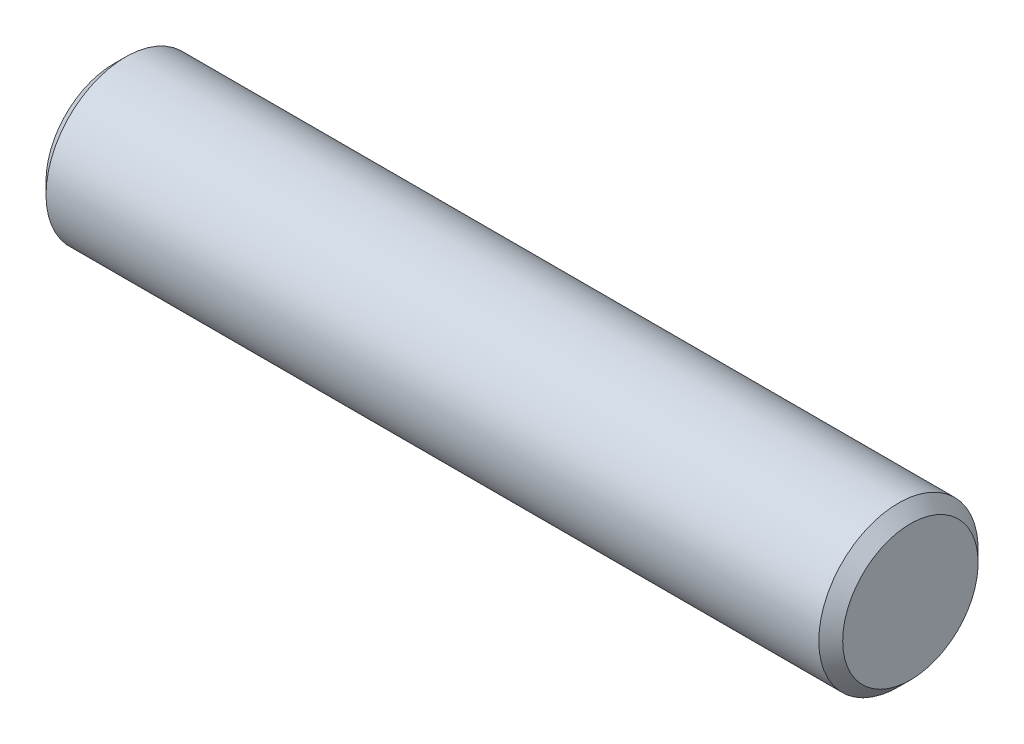
ISO-10303-21;
HEADER;
FILE_DESCRIPTION(('STEP AP214'),'2;1');
FILE_NAME('part.step','',(''),(''),'','','');
FILE_SCHEMA(('AUTOMOTIVE_DESIGN { 1 0 10303 214 1 1 1 1 }'));
ENDSEC;
DATA;
#1=APPLICATION_CONTEXT('core data for automotive mechanical design processes');
#2=APPLICATION_PROTOCOL_DEFINITION('international standard','automotive_design',2000,#1);
#3=PRODUCT_CONTEXT('',#1,'mechanical');
#4=PRODUCT('Part','Part','',(#3));
#5=PRODUCT_RELATED_PRODUCT_CATEGORY('part','',(#4));
#6=PRODUCT_DEFINITION_FORMATION('','',#4);
#7=PRODUCT_DEFINITION_CONTEXT('part definition',#1,'design');
#8=PRODUCT_DEFINITION('design','',#6,#7);
#9=PRODUCT_DEFINITION_SHAPE('','',#8);
#10=(LENGTH_UNIT() NAMED_UNIT(*) SI_UNIT(.MILLI.,.METRE.));
#11=(NAMED_UNIT(*) PLANE_ANGLE_UNIT() SI_UNIT($,.RADIAN.));
#12=(NAMED_UNIT(*) SI_UNIT($,.STERADIAN.) SOLID_ANGLE_UNIT());
#13=UNCERTAINTY_MEASURE_WITH_UNIT(LENGTH_MEASURE(1.E-05),#10,'distance_accuracy_value','');
#14=(GEOMETRIC_REPRESENTATION_CONTEXT(3) GLOBAL_UNCERTAINTY_ASSIGNED_CONTEXT((#13)) GLOBAL_UNIT_ASSIGNED_CONTEXT((#10,
#11,#12)) REPRESENTATION_CONTEXT('',''));
#15=CARTESIAN_POINT('',(0.,0.,0.));
#16=DIRECTION('',(0.,0.,1.));
#17=DIRECTION('',(1.,0.,0.));
#18=AXIS2_PLACEMENT_3D('',#15,#16,#17);
#19=CARTESIAN_POINT('',(0.,8.5,0.));
#20=DIRECTION('',(1.,0.,0.));
#21=DIRECTION('',(0.,0.,-1.));
#22=AXIS2_PLACEMENT_3D('',#19,#20,#21);
#23=PLANE('',#22);
#24=CARTESIAN_POINT('',(0.,0.,0.));
#25=DIRECTION('',(-1.,0.,0.));
#26=DIRECTION('',(0.,0.,1.));
#27=AXIS2_PLACEMENT_3D('',#24,#25,#26);
#28=CIRCLE('',#27,8.5);
#29=CARTESIAN_POINT('',(0.,0.,8.5));
#30=VERTEX_POINT('',#29);
#31=EDGE_CURVE('E10',#30,#30,#28,.T.);
#32=ORIENTED_EDGE('',*,*,#31,.T.);
#33=EDGE_LOOP('',(#32));
#34=FACE_BOUND('',#33,.T.);
#35=ADVANCED_FACE('F30',(#34),#23,.F.);
#36=CARTESIAN_POINT('',(1.49999999999995,0.,0.));
#37=DIRECTION('',(1.,0.,0.));
#38=DIRECTION('',(0.,0.,-1.));
#39=AXIS2_PLACEMENT_3D('',#36,#37,#38);
#40=CONICAL_SURFACE('',#39,10.,0.785398163397484);
#41=ORIENTED_EDGE('',*,*,#31,.F.);
#42=EDGE_LOOP('',(#41));
#43=FACE_BOUND('',#42,.T.);
#44=CARTESIAN_POINT('',(1.49999999999995,0.,0.));
#45=DIRECTION('',(-1.,0.,0.));
#46=DIRECTION('',(0.,0.,1.));
#47=AXIS2_PLACEMENT_3D('',#44,#45,#46);
#48=CIRCLE('',#47,10.);
#49=CARTESIAN_POINT('',(1.49999999999995,0.,10.));
#50=VERTEX_POINT('',#49);
#51=EDGE_CURVE('E36',#50,#50,#48,.T.);
#52=ORIENTED_EDGE('',*,*,#51,.T.);
#53=EDGE_LOOP('',(#52));
#54=FACE_BOUND('',#53,.T.);
#55=ADVANCED_FACE('F62',(#43,#54),#40,.T.);
#56=CARTESIAN_POINT('',(-3.175,0.,0.));
#57=DIRECTION('',(-1.,0.,0.));
#58=DIRECTION('',(0.,0.,1.));
#59=AXIS2_PLACEMENT_3D('',#56,#57,#58);
#60=CYLINDRICAL_SURFACE('',#59,10.);
#61=CARTESIAN_POINT('',(98.5,0.,0.));
#62=DIRECTION('',(-1.,0.,0.));
#63=DIRECTION('',(0.,0.,1.));
#64=AXIS2_PLACEMENT_3D('',#61,#62,#63);
#65=CIRCLE('',#64,10.);
#66=CARTESIAN_POINT('',(98.5,0.,10.));
#67=VERTEX_POINT('',#66);
#68=EDGE_CURVE('E40',#67,#67,#65,.T.);
#69=ORIENTED_EDGE('',*,*,#68,.T.);
#70=EDGE_LOOP('',(#69));
#71=FACE_BOUND('',#70,.T.);
#72=ORIENTED_EDGE('',*,*,#51,.F.);
#73=EDGE_LOOP('',(#72));
#74=FACE_BOUND('',#73,.T.);
#75=ADVANCED_FACE('F59',(#71,#74),#60,.T.);
#76=CARTESIAN_POINT('',(98.5,0.,0.));
#77=DIRECTION('',(-1.,0.,0.));
#78=DIRECTION('',(0.,0.,1.));
#79=AXIS2_PLACEMENT_3D('',#76,#77,#78);
#80=CONICAL_SURFACE('',#79,10.,0.785398163397441);
#81=CARTESIAN_POINT('',(100.,0.,0.));
#82=DIRECTION('',(-1.,0.,0.));
#83=DIRECTION('',(0.,0.,1.));
#84=AXIS2_PLACEMENT_3D('',#81,#82,#83);
#85=CIRCLE('',#84,8.5);
#86=CARTESIAN_POINT('',(100.,0.,8.5));
#87=VERTEX_POINT('',#86);
#88=EDGE_CURVE('E44',#87,#87,#85,.T.);
#89=ORIENTED_EDGE('',*,*,#88,.T.);
#90=EDGE_LOOP('',(#89));
#91=FACE_BOUND('',#90,.T.);
#92=ORIENTED_EDGE('',*,*,#68,.F.);
#93=EDGE_LOOP('',(#92));
#94=FACE_BOUND('',#93,.T.);
#95=ADVANCED_FACE('F50',(#91,#94),#80,.T.);
#96=CARTESIAN_POINT('',(100.,8.5,0.));
#97=DIRECTION('',(1.,0.,0.));
#98=DIRECTION('',(0.,0.,-1.));
#99=AXIS2_PLACEMENT_3D('',#96,#97,#98);
#100=PLANE('',#99);
#101=ORIENTED_EDGE('',*,*,#88,.F.);
#102=EDGE_LOOP('',(#101));
#103=FACE_BOUND('',#102,.T.);
#104=ADVANCED_FACE('F53',(#103),#100,.T.);
#105=CLOSED_SHELL('',(#35,#55,#75,#95,#104));
#106=MANIFOLD_SOLID_BREP('B2',#105);
#107=ADVANCED_BREP_SHAPE_REPRESENTATION('',(#18,#106),#14);
#108=SHAPE_DEFINITION_REPRESENTATION(#9,#107);
ENDSEC;
END-ISO-10303-21;
